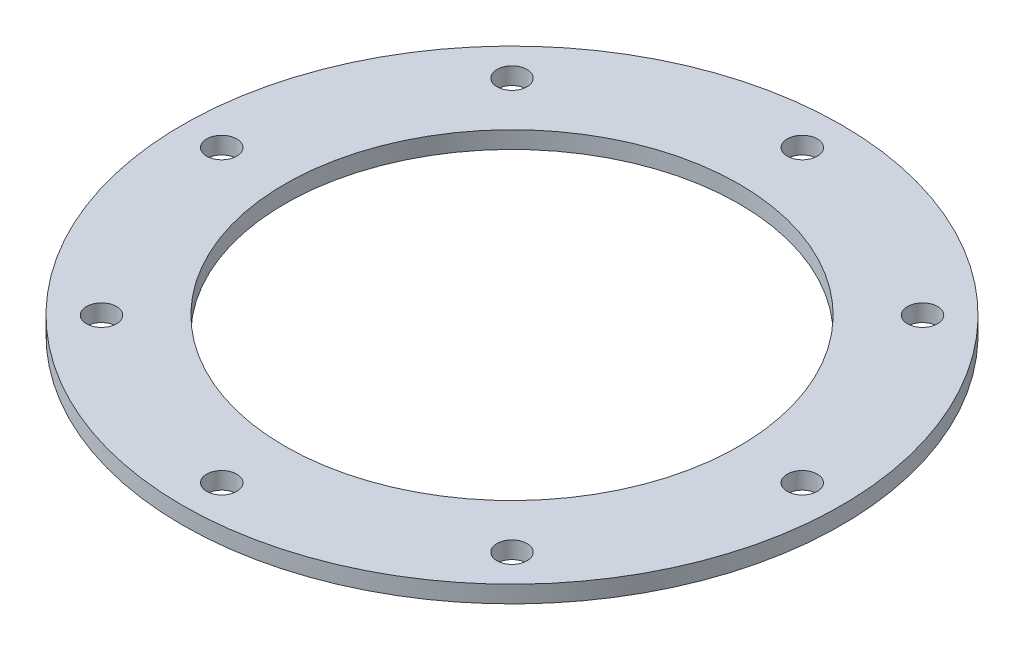
ISO-10303-21;
HEADER;
FILE_DESCRIPTION(('STEP AP214'),'2;1');
FILE_NAME('part.step','',(''),(''),'','','');
FILE_SCHEMA(('AUTOMOTIVE_DESIGN { 1 0 10303 214 1 1 1 1 }'));
ENDSEC;
DATA;
#1=APPLICATION_CONTEXT('core data for automotive mechanical design processes');
#2=APPLICATION_PROTOCOL_DEFINITION('international standard','automotive_design',2000,#1);
#3=PRODUCT_CONTEXT('',#1,'mechanical');
#4=PRODUCT('Part','Part','',(#3));
#5=PRODUCT_RELATED_PRODUCT_CATEGORY('part','',(#4));
#6=PRODUCT_DEFINITION_FORMATION('','',#4);
#7=PRODUCT_DEFINITION_CONTEXT('part definition',#1,'design');
#8=PRODUCT_DEFINITION('design','',#6,#7);
#9=PRODUCT_DEFINITION_SHAPE('','',#8);
#10=(LENGTH_UNIT() NAMED_UNIT(*) SI_UNIT(.MILLI.,.METRE.));
#11=(NAMED_UNIT(*) PLANE_ANGLE_UNIT() SI_UNIT($,.RADIAN.));
#12=(NAMED_UNIT(*) SI_UNIT($,.STERADIAN.) SOLID_ANGLE_UNIT());
#13=UNCERTAINTY_MEASURE_WITH_UNIT(LENGTH_MEASURE(1.E-05),#10,'distance_accuracy_value','');
#14=(GEOMETRIC_REPRESENTATION_CONTEXT(3) GLOBAL_UNCERTAINTY_ASSIGNED_CONTEXT((#13)) GLOBAL_UNIT_ASSIGNED_CONTEXT((#10,
#11,#12)) REPRESENTATION_CONTEXT('',''));
#15=CARTESIAN_POINT('',(0.,0.,0.));
#16=DIRECTION('',(0.,0.,1.));
#17=DIRECTION('',(1.,0.,0.));
#18=AXIS2_PLACEMENT_3D('',#15,#16,#17);
#19=CARTESIAN_POINT('',(0.,5.,0.));
#20=DIRECTION('',(0.,1.,0.));
#21=DIRECTION('',(0.,0.,1.));
#22=AXIS2_PLACEMENT_3D('',#19,#20,#21);
#23=PLANE('',#22);
#24=CARTESIAN_POINT('',(0.,5.,-85.));
#25=DIRECTION('',(0.,1.,0.));
#26=DIRECTION('',(0.,0.,1.));
#27=AXIS2_PLACEMENT_3D('',#24,#25,#26);
#28=CIRCLE('',#27,4.4);
#29=CARTESIAN_POINT('',(0.,5.,-80.6));
#30=VERTEX_POINT('',#29);
#31=EDGE_CURVE('E92',#30,#30,#28,.T.);
#32=ORIENTED_EDGE('',*,*,#31,.F.);
#33=EDGE_LOOP('',(#32));
#34=FACE_BOUND('',#33,.T.);
#35=CARTESIAN_POINT('',(-85.,5.,0.));
#36=DIRECTION('',(0.,1.,0.));
#37=DIRECTION('',(0.,0.,1.));
#38=AXIS2_PLACEMENT_3D('',#35,#36,#37);
#39=CIRCLE('',#38,4.4);
#40=CARTESIAN_POINT('',(-85.,5.,4.39999999999999));
#41=VERTEX_POINT('',#40);
#42=EDGE_CURVE('E79',#41,#41,#39,.T.);
#43=ORIENTED_EDGE('',*,*,#42,.F.);
#44=EDGE_LOOP('',(#43));
#45=FACE_BOUND('',#44,.T.);
#46=CARTESIAN_POINT('',(0.,5.,85.));
#47=DIRECTION('',(0.,1.,0.));
#48=DIRECTION('',(0.,0.,1.));
#49=AXIS2_PLACEMENT_3D('',#46,#47,#48);
#50=CIRCLE('',#49,4.4);
#51=CARTESIAN_POINT('',(0.,5.,89.4));
#52=VERTEX_POINT('',#51);
#53=EDGE_CURVE('E67',#52,#52,#50,.T.);
#54=ORIENTED_EDGE('',*,*,#53,.F.);
#55=EDGE_LOOP('',(#54));
#56=FACE_BOUND('',#55,.T.);
#57=CARTESIAN_POINT('',(85.,5.,0.));
#58=DIRECTION('',(0.,1.,0.));
#59=DIRECTION('',(0.,0.,1.));
#60=AXIS2_PLACEMENT_3D('',#57,#58,#59);
#61=CIRCLE('',#60,4.4);
#62=CARTESIAN_POINT('',(85.,5.,4.4));
#63=VERTEX_POINT('',#62);
#64=EDGE_CURVE('E54',#63,#63,#61,.T.);
#65=ORIENTED_EDGE('',*,*,#64,.F.);
#66=EDGE_LOOP('',(#65));
#67=FACE_BOUND('',#66,.T.);
#68=CARTESIAN_POINT('',(0.,5.,0.));
#69=DIRECTION('',(0.,1.,0.));
#70=DIRECTION('',(0.,0.,1.));
#71=AXIS2_PLACEMENT_3D('',#68,#69,#70);
#72=CIRCLE('',#71,96.5);
#73=CARTESIAN_POINT('',(0.,5.,96.5));
#74=VERTEX_POINT('',#73);
#75=EDGE_CURVE('E10',#74,#74,#72,.T.);
#76=ORIENTED_EDGE('',*,*,#75,.T.);
#77=EDGE_LOOP('',(#76));
#78=FACE_BOUND('',#77,.T.);
#79=CARTESIAN_POINT('',(0.,5.,0.));
#80=DIRECTION('',(0.,1.,0.));
#81=DIRECTION('',(0.,0.,1.));
#82=AXIS2_PLACEMENT_3D('',#79,#80,#81);
#83=CIRCLE('',#82,66.5);
#84=CARTESIAN_POINT('',(0.,5.,66.5));
#85=VERTEX_POINT('',#84);
#86=EDGE_CURVE('E49',#85,#85,#83,.T.);
#87=ORIENTED_EDGE('',*,*,#86,.F.);
#88=EDGE_LOOP('',(#87));
#89=FACE_BOUND('',#88,.T.);
#90=CARTESIAN_POINT('',(60.1040764008565,5.,60.1040764008565));
#91=DIRECTION('',(0.,1.,0.));
#92=DIRECTION('',(0.,0.,1.));
#93=AXIS2_PLACEMENT_3D('',#90,#91,#92);
#94=CIRCLE('',#93,4.39999999999997);
#95=CARTESIAN_POINT('',(60.1040764008565,5.,64.5040764008565));
#96=VERTEX_POINT('',#95);
#97=EDGE_CURVE('E62',#96,#96,#94,.T.);
#98=ORIENTED_EDGE('',*,*,#97,.F.);
#99=EDGE_LOOP('',(#98));
#100=FACE_BOUND('',#99,.T.);
#101=CARTESIAN_POINT('',(-60.1040764008565,5.,60.1040764008565));
#102=DIRECTION('',(0.,1.,0.));
#103=DIRECTION('',(0.,0.,1.));
#104=AXIS2_PLACEMENT_3D('',#101,#102,#103);
#105=CIRCLE('',#104,4.4);
#106=CARTESIAN_POINT('',(-60.1040764008565,5.,64.5040764008565));
#107=VERTEX_POINT('',#106);
#108=EDGE_CURVE('E73',#107,#107,#105,.T.);
#109=ORIENTED_EDGE('',*,*,#108,.F.);
#110=EDGE_LOOP('',(#109));
#111=FACE_BOUND('',#110,.T.);
#112=CARTESIAN_POINT('',(-60.1040764008565,5.,-60.1040764008566));
#113=DIRECTION('',(0.,1.,0.));
#114=DIRECTION('',(0.,0.,1.));
#115=AXIS2_PLACEMENT_3D('',#112,#113,#114);
#116=CIRCLE('',#115,4.4);
#117=CARTESIAN_POINT('',(-60.1040764008565,5.,-55.7040764008566));
#118=VERTEX_POINT('',#117);
#119=EDGE_CURVE('E83',#118,#118,#116,.T.);
#120=ORIENTED_EDGE('',*,*,#119,.F.);
#121=EDGE_LOOP('',(#120));
#122=FACE_BOUND('',#121,.T.);
#123=CARTESIAN_POINT('',(60.1040764008566,5.,-60.1040764008565));
#124=DIRECTION('',(0.,1.,0.));
#125=DIRECTION('',(0.,0.,1.));
#126=AXIS2_PLACEMENT_3D('',#123,#124,#125);
#127=CIRCLE('',#126,4.4);
#128=CARTESIAN_POINT('',(60.1040764008566,5.,-55.7040764008565));
#129=VERTEX_POINT('',#128);
#130=EDGE_CURVE('E97',#129,#129,#127,.T.);
#131=ORIENTED_EDGE('',*,*,#130,.F.);
#132=EDGE_LOOP('',(#131));
#133=FACE_BOUND('',#132,.T.);
#134=ADVANCED_FACE('F39',(#34,#45,#56,#67,#78,#89,#100,#111,#122,#133),#23,.T.);
#135=CARTESIAN_POINT('',(0.,0.,0.));
#136=DIRECTION('',(0.,1.,0.));
#137=DIRECTION('',(0.,0.,1.));
#138=AXIS2_PLACEMENT_3D('',#135,#136,#137);
#139=PLANE('',#138);
#140=CARTESIAN_POINT('',(0.,0.,0.));
#141=DIRECTION('',(0.,1.,0.));
#142=DIRECTION('',(0.,0.,1.));
#143=AXIS2_PLACEMENT_3D('',#140,#141,#142);
#144=CIRCLE('',#143,96.5);
#145=CARTESIAN_POINT('',(0.,0.,96.5));
#146=VERTEX_POINT('',#145);
#147=EDGE_CURVE('E43',#146,#146,#144,.T.);
#148=ORIENTED_EDGE('',*,*,#147,.F.);
#149=EDGE_LOOP('',(#148));
#150=FACE_BOUND('',#149,.T.);
#151=CARTESIAN_POINT('',(0.,0.,0.));
#152=DIRECTION('',(0.,1.,0.));
#153=DIRECTION('',(0.,0.,1.));
#154=AXIS2_PLACEMENT_3D('',#151,#152,#153);
#155=CIRCLE('',#154,66.5);
#156=CARTESIAN_POINT('',(0.,0.,66.5));
#157=VERTEX_POINT('',#156);
#158=EDGE_CURVE('E55',#157,#157,#155,.T.);
#159=ORIENTED_EDGE('',*,*,#158,.T.);
#160=EDGE_LOOP('',(#159));
#161=FACE_BOUND('',#160,.T.);
#162=CARTESIAN_POINT('',(85.,0.,0.));
#163=DIRECTION('',(0.,1.,0.));
#164=DIRECTION('',(0.,0.,1.));
#165=AXIS2_PLACEMENT_3D('',#162,#163,#164);
#166=CIRCLE('',#165,4.4);
#167=CARTESIAN_POINT('',(85.,0.,4.4));
#168=VERTEX_POINT('',#167);
#169=EDGE_CURVE('E59',#168,#168,#166,.T.);
#170=ORIENTED_EDGE('',*,*,#169,.T.);
#171=EDGE_LOOP('',(#170));
#172=FACE_BOUND('',#171,.T.);
#173=CARTESIAN_POINT('',(60.1040764008565,0.,60.1040764008565));
#174=DIRECTION('',(0.,1.,0.));
#175=DIRECTION('',(0.,0.,1.));
#176=AXIS2_PLACEMENT_3D('',#173,#174,#175);
#177=CIRCLE('',#176,4.39999999999997);
#178=CARTESIAN_POINT('',(60.1040764008565,0.,64.5040764008565));
#179=VERTEX_POINT('',#178);
#180=EDGE_CURVE('E61',#179,#179,#177,.T.);
#181=ORIENTED_EDGE('',*,*,#180,.T.);
#182=EDGE_LOOP('',(#181));
#183=FACE_BOUND('',#182,.T.);
#184=CARTESIAN_POINT('',(0.,0.,85.));
#185=DIRECTION('',(0.,1.,0.));
#186=DIRECTION('',(0.,0.,1.));
#187=AXIS2_PLACEMENT_3D('',#184,#185,#186);
#188=CIRCLE('',#187,4.4);
#189=CARTESIAN_POINT('',(0.,0.,89.4));
#190=VERTEX_POINT('',#189);
#191=EDGE_CURVE('E70',#190,#190,#188,.T.);
#192=ORIENTED_EDGE('',*,*,#191,.T.);
#193=EDGE_LOOP('',(#192));
#194=FACE_BOUND('',#193,.T.);
#195=CARTESIAN_POINT('',(-60.1040764008565,0.,60.1040764008565));
#196=DIRECTION('',(0.,1.,0.));
#197=DIRECTION('',(0.,0.,1.));
#198=AXIS2_PLACEMENT_3D('',#195,#196,#197);
#199=CIRCLE('',#198,4.4);
#200=CARTESIAN_POINT('',(-60.1040764008565,0.,64.5040764008565));
#201=VERTEX_POINT('',#200);
#202=EDGE_CURVE('E77',#201,#201,#199,.T.);
#203=ORIENTED_EDGE('',*,*,#202,.T.);
#204=EDGE_LOOP('',(#203));
#205=FACE_BOUND('',#204,.T.);
#206=CARTESIAN_POINT('',(-85.,0.,0.));
#207=DIRECTION('',(0.,1.,0.));
#208=DIRECTION('',(0.,0.,1.));
#209=AXIS2_PLACEMENT_3D('',#206,#207,#208);
#210=CIRCLE('',#209,4.4);
#211=CARTESIAN_POINT('',(-85.,0.,4.39999999999999));
#212=VERTEX_POINT('',#211);
#213=EDGE_CURVE('E84',#212,#212,#210,.T.);
#214=ORIENTED_EDGE('',*,*,#213,.T.);
#215=EDGE_LOOP('',(#214));
#216=FACE_BOUND('',#215,.T.);
#217=CARTESIAN_POINT('',(-60.1040764008565,0.,-60.1040764008566));
#218=DIRECTION('',(0.,1.,0.));
#219=DIRECTION('',(0.,0.,1.));
#220=AXIS2_PLACEMENT_3D('',#217,#218,#219);
#221=CIRCLE('',#220,4.4);
#222=CARTESIAN_POINT('',(-60.1040764008565,0.,-55.7040764008566));
#223=VERTEX_POINT('',#222);
#224=EDGE_CURVE('E89',#223,#223,#221,.T.);
#225=ORIENTED_EDGE('',*,*,#224,.T.);
#226=EDGE_LOOP('',(#225));
#227=FACE_BOUND('',#226,.T.);
#228=CARTESIAN_POINT('',(0.,0.,-85.));
#229=DIRECTION('',(0.,1.,0.));
#230=DIRECTION('',(0.,0.,1.));
#231=AXIS2_PLACEMENT_3D('',#228,#229,#230);
#232=CIRCLE('',#231,4.4);
#233=CARTESIAN_POINT('',(0.,0.,-80.6));
#234=VERTEX_POINT('',#233);
#235=EDGE_CURVE('E94',#234,#234,#232,.T.);
#236=ORIENTED_EDGE('',*,*,#235,.T.);
#237=EDGE_LOOP('',(#236));
#238=FACE_BOUND('',#237,.T.);
#239=CARTESIAN_POINT('',(60.1040764008566,0.,-60.1040764008565));
#240=DIRECTION('',(0.,1.,0.));
#241=DIRECTION('',(0.,0.,1.));
#242=AXIS2_PLACEMENT_3D('',#239,#240,#241);
#243=CIRCLE('',#242,4.4);
#244=CARTESIAN_POINT('',(60.1040764008566,0.,-55.7040764008565));
#245=VERTEX_POINT('',#244);
#246=EDGE_CURVE('E99',#245,#245,#243,.T.);
#247=ORIENTED_EDGE('',*,*,#246,.T.);
#248=EDGE_LOOP('',(#247));
#249=FACE_BOUND('',#248,.T.);
#250=ADVANCED_FACE('F109',(#150,#161,#172,#183,#194,#205,#216,#227,#238,#249),#139,.F.);
#251=CARTESIAN_POINT('',(0.,5.,0.));
#252=DIRECTION('',(0.,-1.,0.));
#253=DIRECTION('',(0.,0.,-1.));
#254=AXIS2_PLACEMENT_3D('',#251,#252,#253);
#255=CYLINDRICAL_SURFACE('',#254,96.5);
#256=ORIENTED_EDGE('',*,*,#75,.F.);
#257=EDGE_LOOP('',(#256));
#258=FACE_BOUND('',#257,.T.);
#259=ORIENTED_EDGE('',*,*,#147,.T.);
#260=EDGE_LOOP('',(#259));
#261=FACE_BOUND('',#260,.T.);
#262=ADVANCED_FACE('F41',(#258,#261),#255,.T.);
#263=CARTESIAN_POINT('',(0.,5.,0.));
#264=DIRECTION('',(0.,-1.,0.));
#265=DIRECTION('',(0.,0.,-1.));
#266=AXIS2_PLACEMENT_3D('',#263,#264,#265);
#267=CYLINDRICAL_SURFACE('',#266,66.5);
#268=ORIENTED_EDGE('',*,*,#86,.T.);
#269=EDGE_LOOP('',(#268));
#270=FACE_BOUND('',#269,.T.);
#271=ORIENTED_EDGE('',*,*,#158,.F.);
#272=EDGE_LOOP('',(#271));
#273=FACE_BOUND('',#272,.T.);
#274=ADVANCED_FACE('F119',(#270,#273),#267,.F.);
#275=CARTESIAN_POINT('',(85.,5.,0.));
#276=DIRECTION('',(0.,-1.,0.));
#277=DIRECTION('',(0.,0.,-1.));
#278=AXIS2_PLACEMENT_3D('',#275,#276,#277);
#279=CYLINDRICAL_SURFACE('',#278,4.4);
#280=ORIENTED_EDGE('',*,*,#64,.T.);
#281=EDGE_LOOP('',(#280));
#282=FACE_BOUND('',#281,.T.);
#283=ORIENTED_EDGE('',*,*,#169,.F.);
#284=EDGE_LOOP('',(#283));
#285=FACE_BOUND('',#284,.T.);
#286=ADVANCED_FACE('F124',(#282,#285),#279,.F.);
#287=CARTESIAN_POINT('',(60.1040764008565,5.,60.1040764008565));
#288=DIRECTION('',(0.,-1.,0.));
#289=DIRECTION('',(0.,0.,-1.));
#290=AXIS2_PLACEMENT_3D('',#287,#288,#289);
#291=CYLINDRICAL_SURFACE('',#290,4.39999999999997);
#292=ORIENTED_EDGE('',*,*,#97,.T.);
#293=EDGE_LOOP('',(#292));
#294=FACE_BOUND('',#293,.T.);
#295=ORIENTED_EDGE('',*,*,#180,.F.);
#296=EDGE_LOOP('',(#295));
#297=FACE_BOUND('',#296,.T.);
#298=ADVANCED_FACE('F129',(#294,#297),#291,.F.);
#299=CARTESIAN_POINT('',(0.,5.,85.));
#300=DIRECTION('',(0.,-1.,0.));
#301=DIRECTION('',(0.,0.,-1.));
#302=AXIS2_PLACEMENT_3D('',#299,#300,#301);
#303=CYLINDRICAL_SURFACE('',#302,4.4);
#304=ORIENTED_EDGE('',*,*,#53,.T.);
#305=EDGE_LOOP('',(#304));
#306=FACE_BOUND('',#305,.T.);
#307=ORIENTED_EDGE('',*,*,#191,.F.);
#308=EDGE_LOOP('',(#307));
#309=FACE_BOUND('',#308,.T.);
#310=ADVANCED_FACE('F131',(#306,#309),#303,.F.);
#311=CARTESIAN_POINT('',(-60.1040764008565,5.,60.1040764008565));
#312=DIRECTION('',(0.,-1.,0.));
#313=DIRECTION('',(0.,0.,-1.));
#314=AXIS2_PLACEMENT_3D('',#311,#312,#313);
#315=CYLINDRICAL_SURFACE('',#314,4.4);
#316=ORIENTED_EDGE('',*,*,#108,.T.);
#317=EDGE_LOOP('',(#316));
#318=FACE_BOUND('',#317,.T.);
#319=ORIENTED_EDGE('',*,*,#202,.F.);
#320=EDGE_LOOP('',(#319));
#321=FACE_BOUND('',#320,.T.);
#322=ADVANCED_FACE('F135',(#318,#321),#315,.F.);
#323=CARTESIAN_POINT('',(-85.,5.,0.));
#324=DIRECTION('',(0.,-1.,0.));
#325=DIRECTION('',(0.,0.,-1.));
#326=AXIS2_PLACEMENT_3D('',#323,#324,#325);
#327=CYLINDRICAL_SURFACE('',#326,4.4);
#328=ORIENTED_EDGE('',*,*,#42,.T.);
#329=EDGE_LOOP('',(#328));
#330=FACE_BOUND('',#329,.T.);
#331=ORIENTED_EDGE('',*,*,#213,.F.);
#332=EDGE_LOOP('',(#331));
#333=FACE_BOUND('',#332,.T.);
#334=ADVANCED_FACE('F139',(#330,#333),#327,.F.);
#335=CARTESIAN_POINT('',(-60.1040764008565,5.,-60.1040764008566));
#336=DIRECTION('',(0.,-1.,0.));
#337=DIRECTION('',(0.,0.,-1.));
#338=AXIS2_PLACEMENT_3D('',#335,#336,#337);
#339=CYLINDRICAL_SURFACE('',#338,4.4);
#340=ORIENTED_EDGE('',*,*,#119,.T.);
#341=EDGE_LOOP('',(#340));
#342=FACE_BOUND('',#341,.T.);
#343=ORIENTED_EDGE('',*,*,#224,.F.);
#344=EDGE_LOOP('',(#343));
#345=FACE_BOUND('',#344,.T.);
#346=ADVANCED_FACE('F141',(#342,#345),#339,.F.);
#347=CARTESIAN_POINT('',(0.,5.,-85.));
#348=DIRECTION('',(0.,-1.,0.));
#349=DIRECTION('',(0.,0.,-1.));
#350=AXIS2_PLACEMENT_3D('',#347,#348,#349);
#351=CYLINDRICAL_SURFACE('',#350,4.4);
#352=ORIENTED_EDGE('',*,*,#31,.T.);
#353=EDGE_LOOP('',(#352));
#354=FACE_BOUND('',#353,.T.);
#355=ORIENTED_EDGE('',*,*,#235,.F.);
#356=EDGE_LOOP('',(#355));
#357=FACE_BOUND('',#356,.T.);
#358=ADVANCED_FACE('F149',(#354,#357),#351,.F.);
#359=CARTESIAN_POINT('',(60.1040764008566,5.,-60.1040764008565));
#360=DIRECTION('',(0.,-1.,0.));
#361=DIRECTION('',(0.,0.,-1.));
#362=AXIS2_PLACEMENT_3D('',#359,#360,#361);
#363=CYLINDRICAL_SURFACE('',#362,4.4);
#364=ORIENTED_EDGE('',*,*,#130,.T.);
#365=EDGE_LOOP('',(#364));
#366=FACE_BOUND('',#365,.T.);
#367=ORIENTED_EDGE('',*,*,#246,.F.);
#368=EDGE_LOOP('',(#367));
#369=FACE_BOUND('',#368,.T.);
#370=ADVANCED_FACE('F106',(#366,#369),#363,.F.);
#371=CLOSED_SHELL('',(#134,#250,#262,#274,#286,#298,#310,#322,#334,#346,#358,#370));
#372=MANIFOLD_SOLID_BREP('B2',#371);
#373=ADVANCED_BREP_SHAPE_REPRESENTATION('',(#18,#372),#14);
#374=SHAPE_DEFINITION_REPRESENTATION(#9,#373);
ENDSEC;
END-ISO-10303-21;
